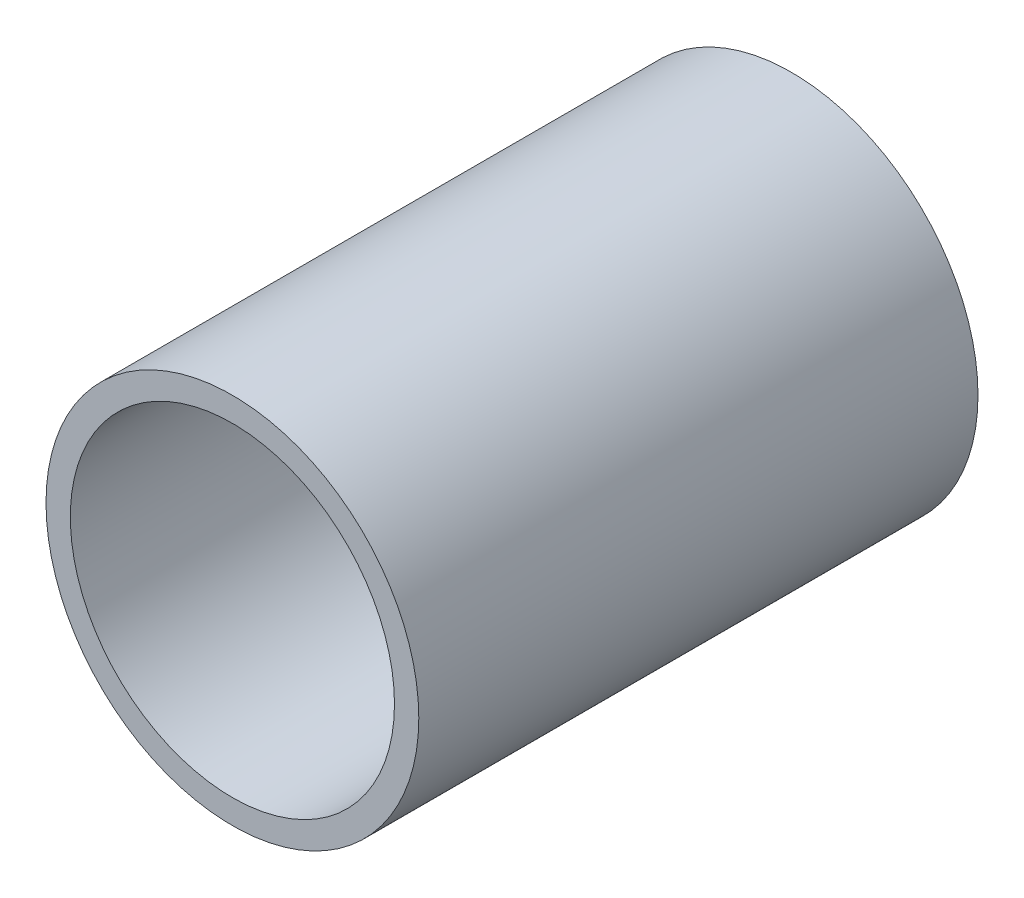
ISO-10303-21;
HEADER;
FILE_DESCRIPTION(('STEP AP214'),'2;1');
FILE_NAME('part.step','',(''),(''),'','','');
FILE_SCHEMA(('AUTOMOTIVE_DESIGN { 1 0 10303 214 1 1 1 1 }'));
ENDSEC;
DATA;
#1=APPLICATION_CONTEXT('core data for automotive mechanical design processes');
#2=APPLICATION_PROTOCOL_DEFINITION('international standard','automotive_design',2000,#1);
#3=PRODUCT_CONTEXT('',#1,'mechanical');
#4=PRODUCT('Part','Part','',(#3));
#5=PRODUCT_RELATED_PRODUCT_CATEGORY('part','',(#4));
#6=PRODUCT_DEFINITION_FORMATION('','',#4);
#7=PRODUCT_DEFINITION_CONTEXT('part definition',#1,'design');
#8=PRODUCT_DEFINITION('design','',#6,#7);
#9=PRODUCT_DEFINITION_SHAPE('','',#8);
#10=(LENGTH_UNIT() NAMED_UNIT(*) SI_UNIT(.MILLI.,.METRE.));
#11=(NAMED_UNIT(*) PLANE_ANGLE_UNIT() SI_UNIT($,.RADIAN.));
#12=(NAMED_UNIT(*) SI_UNIT($,.STERADIAN.) SOLID_ANGLE_UNIT());
#13=UNCERTAINTY_MEASURE_WITH_UNIT(LENGTH_MEASURE(1.E-05),#10,'distance_accuracy_value','');
#14=(GEOMETRIC_REPRESENTATION_CONTEXT(3) GLOBAL_UNCERTAINTY_ASSIGNED_CONTEXT((#13)) GLOBAL_UNIT_ASSIGNED_CONTEXT((#10,
#11,#12)) REPRESENTATION_CONTEXT('',''));
#15=CARTESIAN_POINT('',(0.,0.,0.));
#16=DIRECTION('',(0.,0.,1.));
#17=DIRECTION('',(1.,0.,0.));
#18=AXIS2_PLACEMENT_3D('',#15,#16,#17);
#19=CARTESIAN_POINT('',(0.,0.,69.));
#20=DIRECTION('',(0.,0.,1.));
#21=DIRECTION('',(1.,0.,0.));
#22=AXIS2_PLACEMENT_3D('',#19,#20,#21);
#23=PLANE('',#22);
#24=CARTESIAN_POINT('',(0.,0.,69.));
#25=DIRECTION('',(0.,0.,1.));
#26=DIRECTION('',(1.,0.,0.));
#27=AXIS2_PLACEMENT_3D('',#24,#25,#26);
#28=CIRCLE('',#27,23.);
#29=CARTESIAN_POINT('',(23.,0.,69.));
#30=VERTEX_POINT('',#29);
#31=EDGE_CURVE('E10',#30,#30,#28,.T.);
#32=ORIENTED_EDGE('',*,*,#31,.T.);
#33=EDGE_LOOP('',(#32));
#34=FACE_BOUND('',#33,.T.);
#35=CARTESIAN_POINT('',(0.,0.,69.));
#36=DIRECTION('',(0.,0.,1.));
#37=DIRECTION('',(1.,0.,0.));
#38=AXIS2_PLACEMENT_3D('',#35,#36,#37);
#39=CIRCLE('',#38,20.);
#40=CARTESIAN_POINT('',(20.,0.,69.));
#41=VERTEX_POINT('',#40);
#42=EDGE_CURVE('E50',#41,#41,#39,.T.);
#43=ORIENTED_EDGE('',*,*,#42,.F.);
#44=EDGE_LOOP('',(#43));
#45=FACE_BOUND('',#44,.T.);
#46=ADVANCED_FACE('F37',(#34,#45),#23,.T.);
#47=CARTESIAN_POINT('',(0.,0.,0.));
#48=DIRECTION('',(0.,0.,1.));
#49=DIRECTION('',(1.,0.,0.));
#50=AXIS2_PLACEMENT_3D('',#47,#48,#49);
#51=PLANE('',#50);
#52=CARTESIAN_POINT('',(0.,0.,0.));
#53=DIRECTION('',(0.,0.,1.));
#54=DIRECTION('',(1.,0.,0.));
#55=AXIS2_PLACEMENT_3D('',#52,#53,#54);
#56=CIRCLE('',#55,23.);
#57=CARTESIAN_POINT('',(23.,0.,0.));
#58=VERTEX_POINT('',#57);
#59=EDGE_CURVE('E41',#58,#58,#56,.T.);
#60=ORIENTED_EDGE('',*,*,#59,.F.);
#61=EDGE_LOOP('',(#60));
#62=FACE_BOUND('',#61,.T.);
#63=CARTESIAN_POINT('',(0.,0.,0.));
#64=DIRECTION('',(0.,0.,1.));
#65=DIRECTION('',(1.,0.,0.));
#66=AXIS2_PLACEMENT_3D('',#63,#64,#65);
#67=CIRCLE('',#66,20.);
#68=CARTESIAN_POINT('',(20.,0.,0.));
#69=VERTEX_POINT('',#68);
#70=EDGE_CURVE('E52',#69,#69,#67,.T.);
#71=ORIENTED_EDGE('',*,*,#70,.T.);
#72=EDGE_LOOP('',(#71));
#73=FACE_BOUND('',#72,.T.);
#74=ADVANCED_FACE('F64',(#62,#73),#51,.F.);
#75=CARTESIAN_POINT('',(0.,0.,69.));
#76=DIRECTION('',(0.,0.,-1.));
#77=DIRECTION('',(-1.,0.,0.));
#78=AXIS2_PLACEMENT_3D('',#75,#76,#77);
#79=CYLINDRICAL_SURFACE('',#78,23.);
#80=ORIENTED_EDGE('',*,*,#31,.F.);
#81=EDGE_LOOP('',(#80));
#82=FACE_BOUND('',#81,.T.);
#83=ORIENTED_EDGE('',*,*,#59,.T.);
#84=EDGE_LOOP('',(#83));
#85=FACE_BOUND('',#84,.T.);
#86=ADVANCED_FACE('F39',(#82,#85),#79,.T.);
#87=CARTESIAN_POINT('',(0.,0.,69.));
#88=DIRECTION('',(0.,0.,-1.));
#89=DIRECTION('',(-1.,0.,0.));
#90=AXIS2_PLACEMENT_3D('',#87,#88,#89);
#91=CYLINDRICAL_SURFACE('',#90,20.);
#92=ORIENTED_EDGE('',*,*,#42,.T.);
#93=EDGE_LOOP('',(#92));
#94=FACE_BOUND('',#93,.T.);
#95=ORIENTED_EDGE('',*,*,#70,.F.);
#96=EDGE_LOOP('',(#95));
#97=FACE_BOUND('',#96,.T.);
#98=ADVANCED_FACE('F60',(#94,#97),#91,.F.);
#99=CLOSED_SHELL('',(#46,#74,#86,#98));
#100=MANIFOLD_SOLID_BREP('B2',#99);
#101=ADVANCED_BREP_SHAPE_REPRESENTATION('',(#18,#100),#14);
#102=SHAPE_DEFINITION_REPRESENTATION(#9,#101);
ENDSEC;
END-ISO-10303-21;
